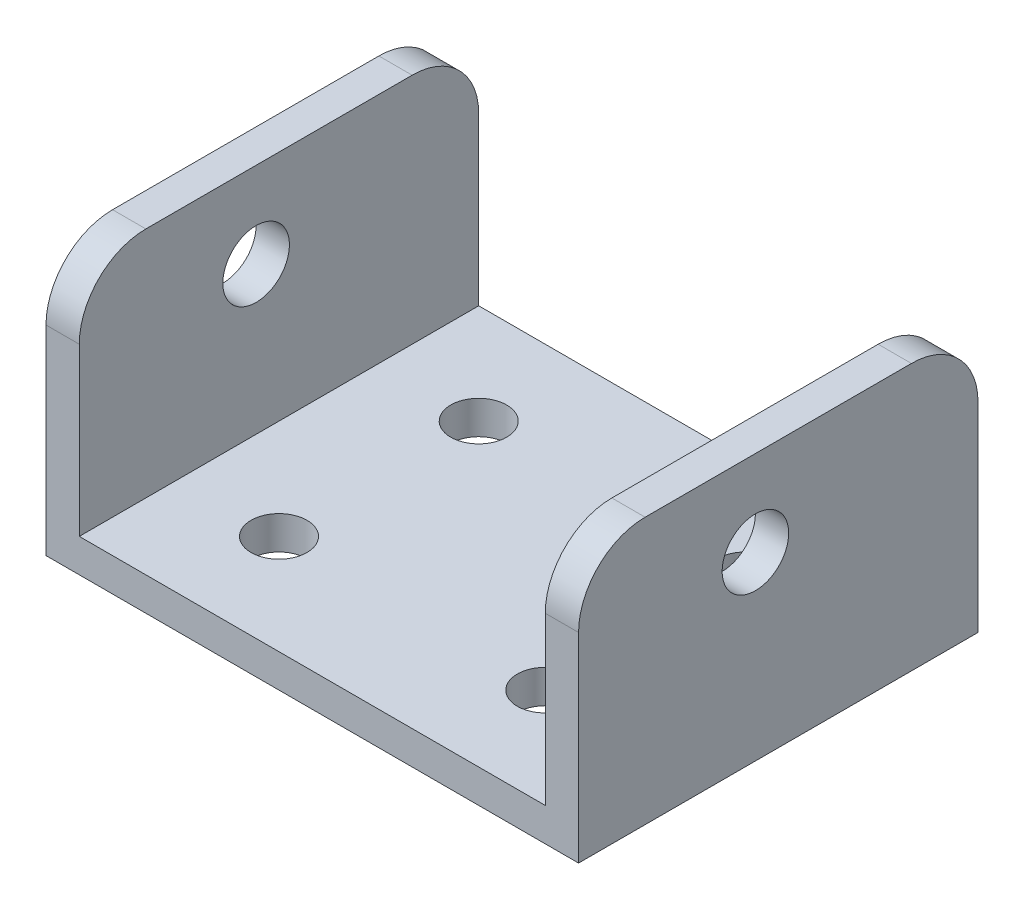
ISO-10303-21;
HEADER;
FILE_DESCRIPTION(('STEP AP214'),'2;1');
FILE_NAME('part.step','',(''),(''),'','','');
FILE_SCHEMA(('AUTOMOTIVE_DESIGN { 1 0 10303 214 1 1 1 1 }'));
ENDSEC;
DATA;
#1=APPLICATION_CONTEXT('core data for automotive mechanical design processes');
#2=APPLICATION_PROTOCOL_DEFINITION('international standard','automotive_design',2000,#1);
#3=PRODUCT_CONTEXT('',#1,'mechanical');
#4=PRODUCT('Part','Part','',(#3));
#5=PRODUCT_RELATED_PRODUCT_CATEGORY('part','',(#4));
#6=PRODUCT_DEFINITION_FORMATION('','',#4);
#7=PRODUCT_DEFINITION_CONTEXT('part definition',#1,'design');
#8=PRODUCT_DEFINITION('design','',#6,#7);
#9=PRODUCT_DEFINITION_SHAPE('','',#8);
#10=(LENGTH_UNIT() NAMED_UNIT(*) SI_UNIT(.MILLI.,.METRE.));
#11=(NAMED_UNIT(*) PLANE_ANGLE_UNIT() SI_UNIT($,.RADIAN.));
#12=(NAMED_UNIT(*) SI_UNIT($,.STERADIAN.) SOLID_ANGLE_UNIT());
#13=UNCERTAINTY_MEASURE_WITH_UNIT(LENGTH_MEASURE(1.E-05),#10,'distance_accuracy_value','');
#14=(GEOMETRIC_REPRESENTATION_CONTEXT(3) GLOBAL_UNCERTAINTY_ASSIGNED_CONTEXT((#13)) GLOBAL_UNIT_ASSIGNED_CONTEXT((#10,
#11,#12)) REPRESENTATION_CONTEXT('',''));
#15=CARTESIAN_POINT('',(0.,0.,0.));
#16=DIRECTION('',(0.,0.,1.));
#17=DIRECTION('',(1.,0.,0.));
#18=AXIS2_PLACEMENT_3D('',#15,#16,#17);
#19=CARTESIAN_POINT('',(-22.225,-9.525,38.1));
#20=DIRECTION('',(0.,-1.,0.));
#21=DIRECTION('',(0.,0.,-1.));
#22=AXIS2_PLACEMENT_3D('',#19,#20,#21);
#23=PLANE('',#22);
#24=CARTESIAN_POINT('',(-12.7,-9.525,28.575));
#25=DIRECTION('',(0.,1.,0.));
#26=DIRECTION('',(0.,0.,1.));
#27=AXIS2_PLACEMENT_3D('',#24,#25,#26);
#28=CIRCLE('',#27,2.667);
#29=CARTESIAN_POINT('',(-12.7,-9.525,31.242));
#30=VERTEX_POINT('',#29);
#31=EDGE_CURVE('E463',#30,#30,#28,.T.);
#32=ORIENTED_EDGE('',*,*,#31,.F.);
#33=EDGE_LOOP('',(#32));
#34=FACE_BOUND('',#33,.T.);
#35=CARTESIAN_POINT('',(12.7,-9.525,9.525));
#36=DIRECTION('',(0.,1.,0.));
#37=DIRECTION('',(0.,0.,1.));
#38=AXIS2_PLACEMENT_3D('',#35,#36,#37);
#39=CIRCLE('',#38,2.667);
#40=CARTESIAN_POINT('',(12.7,-9.525,12.192));
#41=VERTEX_POINT('',#40);
#42=EDGE_CURVE('E456',#41,#41,#39,.T.);
#43=ORIENTED_EDGE('',*,*,#42,.F.);
#44=EDGE_LOOP('',(#43));
#45=FACE_BOUND('',#44,.T.);
#46=CARTESIAN_POINT('',(-12.7,-9.525,9.525));
#47=DIRECTION('',(0.,1.,0.));
#48=DIRECTION('',(0.,0.,1.));
#49=AXIS2_PLACEMENT_3D('',#46,#47,#48);
#50=CIRCLE('',#49,2.667);
#51=CARTESIAN_POINT('',(-12.7,-9.525,12.192));
#52=VERTEX_POINT('',#51);
#53=EDGE_CURVE('E457',#52,#52,#50,.T.);
#54=ORIENTED_EDGE('',*,*,#53,.F.);
#55=EDGE_LOOP('',(#54));
#56=FACE_BOUND('',#55,.T.);
#57=CARTESIAN_POINT('',(12.7,-9.525,28.575));
#58=DIRECTION('',(0.,1.,0.));
#59=DIRECTION('',(0.,0.,1.));
#60=AXIS2_PLACEMENT_3D('',#57,#58,#59);
#61=CIRCLE('',#60,2.667);
#62=CARTESIAN_POINT('',(12.7,-9.525,31.242));
#63=VERTEX_POINT('',#62);
#64=EDGE_CURVE('E449',#63,#63,#61,.T.);
#65=ORIENTED_EDGE('',*,*,#64,.F.);
#66=EDGE_LOOP('',(#65));
#67=FACE_BOUND('',#66,.T.);
#68=DIRECTION('',(-1.,0.,0.));
#69=VECTOR('',#68,1.);
#70=CARTESIAN_POINT('',(-22.225,-9.525,0.));
#71=LINE('',#70,#69);
#72=CARTESIAN_POINT('',(22.225,-9.525,0.));
#73=VERTEX_POINT('',#72);
#74=CARTESIAN_POINT('',(-22.225,-9.525,0.));
#75=VERTEX_POINT('',#74);
#76=EDGE_CURVE('E145',#73,#75,#71,.T.);
#77=ORIENTED_EDGE('',*,*,#76,.T.);
#78=DIRECTION('',(0.,0.,-1.));
#79=VECTOR('',#78,1.);
#80=CARTESIAN_POINT('',(-22.225,-9.525,38.1));
#81=LINE('',#80,#79);
#82=CARTESIAN_POINT('',(-22.225,-9.525,38.1));
#83=VERTEX_POINT('',#82);
#84=EDGE_CURVE('E124',#83,#75,#81,.T.);
#85=ORIENTED_EDGE('',*,*,#84,.F.);
#86=DIRECTION('',(-1.,0.,0.));
#87=VECTOR('',#86,1.);
#88=CARTESIAN_POINT('',(-22.225,-9.525,38.1));
#89=LINE('',#88,#87);
#90=CARTESIAN_POINT('',(22.225,-9.525,38.1));
#91=VERTEX_POINT('',#90);
#92=EDGE_CURVE('E131',#91,#83,#89,.T.);
#93=ORIENTED_EDGE('',*,*,#92,.F.);
#94=DIRECTION('',(0.,0.,-1.));
#95=VECTOR('',#94,1.);
#96=CARTESIAN_POINT('',(22.225,-9.525,38.1));
#97=LINE('',#96,#95);
#98=EDGE_CURVE('E216',#91,#73,#97,.T.);
#99=ORIENTED_EDGE('',*,*,#98,.T.);
#100=EDGE_LOOP('',(#77,#85,#93,#99));
#101=FACE_BOUND('',#100,.T.);
#102=ADVANCED_FACE('F32',(#34,#45,#56,#67,#101),#23,.F.);
#103=CARTESIAN_POINT('',(-22.225,-9.525,38.1));
#104=DIRECTION('',(-1.,0.,0.));
#105=DIRECTION('',(0.,0.,1.));
#106=AXIS2_PLACEMENT_3D('',#103,#104,#105);
#107=PLANE('',#106);
#108=CARTESIAN_POINT('',(-22.225,4.54316792929754,21.2332082683315));
#109=DIRECTION('',(-1.,0.,0.));
#110=DIRECTION('',(0.,0.,1.));
#111=AXIS2_PLACEMENT_3D('',#108,#109,#110);
#112=CIRCLE('',#111,3.175);
#113=CARTESIAN_POINT('',(-22.225,4.54316792929754,24.4082082683315));
#114=VERTEX_POINT('',#113);
#115=EDGE_CURVE('E157',#114,#114,#112,.T.);
#116=ORIENTED_EDGE('',*,*,#115,.T.);
#117=EDGE_LOOP('',(#116));
#118=FACE_BOUND('',#117,.T.);
#119=DIRECTION('',(0.,1.,0.));
#120=VECTOR('',#119,1.);
#121=CARTESIAN_POINT('',(-22.225,-9.525,0.));
#122=LINE('',#121,#120);
#123=CARTESIAN_POINT('',(-22.225,6.35,0.));
#124=VERTEX_POINT('',#123);
#125=EDGE_CURVE('E201',#75,#124,#122,.T.);
#126=ORIENTED_EDGE('',*,*,#125,.T.);
#127=CARTESIAN_POINT('',(-22.225,6.35,6.35));
#128=DIRECTION('',(-1.,0.,0.));
#129=DIRECTION('',(0.,0.,1.));
#130=AXIS2_PLACEMENT_3D('',#127,#128,#129);
#131=CIRCLE('',#130,6.35);
#132=CARTESIAN_POINT('',(-22.225,12.7,6.35000000000002));
#133=VERTEX_POINT('',#132);
#134=EDGE_CURVE('E11',#124,#133,#131,.F.);
#135=ORIENTED_EDGE('',*,*,#134,.T.);
#136=DIRECTION('',(0.,0.,-1.));
#137=VECTOR('',#136,1.);
#138=CARTESIAN_POINT('',(-22.225,12.7,38.1));
#139=LINE('',#138,#137);
#140=CARTESIAN_POINT('',(-22.225,12.7,31.75));
#141=VERTEX_POINT('',#140);
#142=EDGE_CURVE('E147',#141,#133,#139,.T.);
#143=ORIENTED_EDGE('',*,*,#142,.F.);
#144=CARTESIAN_POINT('',(-22.225,6.35,31.75));
#145=DIRECTION('',(-1.,0.,0.));
#146=DIRECTION('',(0.,0.,1.));
#147=AXIS2_PLACEMENT_3D('',#144,#145,#146);
#148=CIRCLE('',#147,6.35);
#149=CARTESIAN_POINT('',(-22.225,6.35,38.1));
#150=VERTEX_POINT('',#149);
#151=EDGE_CURVE('E40',#141,#150,#148,.F.);
#152=ORIENTED_EDGE('',*,*,#151,.T.);
#153=DIRECTION('',(0.,1.,0.));
#154=VECTOR('',#153,1.);
#155=CARTESIAN_POINT('',(-22.225,-9.525,38.1));
#156=LINE('',#155,#154);
#157=EDGE_CURVE('E120',#83,#150,#156,.T.);
#158=ORIENTED_EDGE('',*,*,#157,.F.);
#159=ORIENTED_EDGE('',*,*,#84,.T.);
#160=EDGE_LOOP('',(#126,#135,#143,#152,#158,#159));
#161=FACE_BOUND('',#160,.T.);
#162=ADVANCED_FACE('F122',(#118,#161),#107,.F.);
#163=CARTESIAN_POINT('',(-25.4,12.7,38.1));
#164=DIRECTION('',(0.,-1.,0.));
#165=DIRECTION('',(0.,0.,-1.));
#166=AXIS2_PLACEMENT_3D('',#163,#164,#165);
#167=PLANE('',#166);
#168=ORIENTED_EDGE('',*,*,#142,.T.);
#169=DIRECTION('',(-1.,0.,0.));
#170=VECTOR('',#169,1.);
#171=CARTESIAN_POINT('',(-25.4,12.7,6.35));
#172=LINE('',#171,#170);
#173=CARTESIAN_POINT('',(-25.4,12.7,6.35000000000002));
#174=VERTEX_POINT('',#173);
#175=EDGE_CURVE('E179',#133,#174,#172,.T.);
#176=ORIENTED_EDGE('',*,*,#175,.T.);
#177=DIRECTION('',(0.,0.,-1.));
#178=VECTOR('',#177,1.);
#179=CARTESIAN_POINT('',(-25.4,12.7,38.1));
#180=LINE('',#179,#178);
#181=CARTESIAN_POINT('',(-25.4,12.7,31.75));
#182=VERTEX_POINT('',#181);
#183=EDGE_CURVE('E151',#182,#174,#180,.T.);
#184=ORIENTED_EDGE('',*,*,#183,.F.);
#185=DIRECTION('',(-1.,0.,0.));
#186=VECTOR('',#185,1.);
#187=CARTESIAN_POINT('',(-22.225,12.7,31.75));
#188=LINE('',#187,#186);
#189=EDGE_CURVE('E52',#182,#141,#188,.F.);
#190=ORIENTED_EDGE('',*,*,#189,.T.);
#191=EDGE_LOOP('',(#168,#176,#184,#190));
#192=FACE_BOUND('',#191,.T.);
#193=ADVANCED_FACE('F204',(#192),#167,.F.);
#194=CARTESIAN_POINT('',(-25.4,-12.7,38.1));
#195=DIRECTION('',(1.,0.,0.));
#196=DIRECTION('',(0.,0.,-1.));
#197=AXIS2_PLACEMENT_3D('',#194,#195,#196);
#198=PLANE('',#197);
#199=CARTESIAN_POINT('',(-25.4,4.54316792929754,21.2332082683315));
#200=DIRECTION('',(-1.,0.,0.));
#201=DIRECTION('',(0.,0.,1.));
#202=AXIS2_PLACEMENT_3D('',#199,#200,#201);
#203=CIRCLE('',#202,3.175);
#204=CARTESIAN_POINT('',(-25.4,4.54316792929754,24.4082082683315));
#205=VERTEX_POINT('',#204);
#206=EDGE_CURVE('E437',#205,#205,#203,.T.);
#207=ORIENTED_EDGE('',*,*,#206,.F.);
#208=EDGE_LOOP('',(#207));
#209=FACE_BOUND('',#208,.T.);
#210=ORIENTED_EDGE('',*,*,#183,.T.);
#211=CARTESIAN_POINT('',(-25.4,6.35,6.35));
#212=DIRECTION('',(1.,0.,0.));
#213=DIRECTION('',(0.,0.,-1.));
#214=AXIS2_PLACEMENT_3D('',#211,#212,#213);
#215=CIRCLE('',#214,6.35);
#216=CARTESIAN_POINT('',(-25.4,6.35,0.));
#217=VERTEX_POINT('',#216);
#218=EDGE_CURVE('E184',#174,#217,#215,.F.);
#219=ORIENTED_EDGE('',*,*,#218,.T.);
#220=DIRECTION('',(0.,-1.,0.));
#221=VECTOR('',#220,1.);
#222=CARTESIAN_POINT('',(-25.4,-12.7,0.));
#223=LINE('',#222,#221);
#224=CARTESIAN_POINT('',(-25.4,-12.7,0.));
#225=VERTEX_POINT('',#224);
#226=EDGE_CURVE('E190',#217,#225,#223,.T.);
#227=ORIENTED_EDGE('',*,*,#226,.T.);
#228=DIRECTION('',(0.,0.,-1.));
#229=VECTOR('',#228,1.);
#230=CARTESIAN_POINT('',(-25.4,-12.7,38.1));
#231=LINE('',#230,#229);
#232=CARTESIAN_POINT('',(-25.4,-12.7,38.1));
#233=VERTEX_POINT('',#232);
#234=EDGE_CURVE('E207',#233,#225,#231,.T.);
#235=ORIENTED_EDGE('',*,*,#234,.F.);
#236=DIRECTION('',(0.,-1.,0.));
#237=VECTOR('',#236,1.);
#238=CARTESIAN_POINT('',(-25.4,-12.7,38.1));
#239=LINE('',#238,#237);
#240=CARTESIAN_POINT('',(-25.4,6.35,38.1));
#241=VERTEX_POINT('',#240);
#242=EDGE_CURVE('E130',#241,#233,#239,.T.);
#243=ORIENTED_EDGE('',*,*,#242,.F.);
#244=CARTESIAN_POINT('',(-25.4,6.35,31.75));
#245=DIRECTION('',(1.,0.,0.));
#246=DIRECTION('',(0.,0.,-1.));
#247=AXIS2_PLACEMENT_3D('',#244,#245,#246);
#248=CIRCLE('',#247,6.35);
#249=EDGE_CURVE('E182',#241,#182,#248,.F.);
#250=ORIENTED_EDGE('',*,*,#249,.T.);
#251=EDGE_LOOP('',(#210,#219,#227,#235,#243,#250));
#252=FACE_BOUND('',#251,.T.);
#253=ADVANCED_FACE('F188',(#209,#252),#198,.F.);
#254=CARTESIAN_POINT('',(-25.4,-12.7,38.1));
#255=DIRECTION('',(0.,1.,0.));
#256=DIRECTION('',(0.,0.,1.));
#257=AXIS2_PLACEMENT_3D('',#254,#255,#256);
#258=PLANE('',#257);
#259=CARTESIAN_POINT('',(-12.7,-12.7,28.575));
#260=DIRECTION('',(0.,1.,0.));
#261=DIRECTION('',(0.,0.,1.));
#262=AXIS2_PLACEMENT_3D('',#259,#260,#261);
#263=CIRCLE('',#262,2.667);
#264=CARTESIAN_POINT('',(-12.7,-12.7,31.242));
#265=VERTEX_POINT('',#264);
#266=EDGE_CURVE('E452',#265,#265,#263,.F.);
#267=ORIENTED_EDGE('',*,*,#266,.F.);
#268=EDGE_LOOP('',(#267));
#269=FACE_BOUND('',#268,.T.);
#270=CARTESIAN_POINT('',(12.7,-12.7,9.525));
#271=DIRECTION('',(0.,1.,0.));
#272=DIRECTION('',(0.,0.,1.));
#273=AXIS2_PLACEMENT_3D('',#270,#271,#272);
#274=CIRCLE('',#273,2.667);
#275=CARTESIAN_POINT('',(12.7,-12.7,12.192));
#276=VERTEX_POINT('',#275);
#277=EDGE_CURVE('E460',#276,#276,#274,.F.);
#278=ORIENTED_EDGE('',*,*,#277,.F.);
#279=EDGE_LOOP('',(#278));
#280=FACE_BOUND('',#279,.T.);
#281=CARTESIAN_POINT('',(-12.7,-12.7,9.525));
#282=DIRECTION('',(0.,1.,0.));
#283=DIRECTION('',(0.,0.,1.));
#284=AXIS2_PLACEMENT_3D('',#281,#282,#283);
#285=CIRCLE('',#284,2.667);
#286=CARTESIAN_POINT('',(-12.7,-12.7,12.192));
#287=VERTEX_POINT('',#286);
#288=EDGE_CURVE('E453',#287,#287,#285,.F.);
#289=ORIENTED_EDGE('',*,*,#288,.F.);
#290=EDGE_LOOP('',(#289));
#291=FACE_BOUND('',#290,.T.);
#292=CARTESIAN_POINT('',(12.7,-12.7,28.575));
#293=DIRECTION('',(0.,1.,0.));
#294=DIRECTION('',(0.,0.,1.));
#295=AXIS2_PLACEMENT_3D('',#292,#293,#294);
#296=CIRCLE('',#295,2.667);
#297=CARTESIAN_POINT('',(12.7,-12.7,31.242));
#298=VERTEX_POINT('',#297);
#299=EDGE_CURVE('E440',#298,#298,#296,.F.);
#300=ORIENTED_EDGE('',*,*,#299,.F.);
#301=EDGE_LOOP('',(#300));
#302=FACE_BOUND('',#301,.T.);
#303=DIRECTION('',(1.,0.,0.));
#304=VECTOR('',#303,1.);
#305=CARTESIAN_POINT('',(-25.4,-12.7,0.));
#306=LINE('',#305,#304);
#307=CARTESIAN_POINT('',(25.4,-12.7,0.));
#308=VERTEX_POINT('',#307);
#309=EDGE_CURVE('E200',#225,#308,#306,.T.);
#310=ORIENTED_EDGE('',*,*,#309,.T.);
#311=DIRECTION('',(0.,0.,-1.));
#312=VECTOR('',#311,1.);
#313=CARTESIAN_POINT('',(25.4,-12.7,38.1));
#314=LINE('',#313,#312);
#315=CARTESIAN_POINT('',(25.4,-12.7,38.1));
#316=VERTEX_POINT('',#315);
#317=EDGE_CURVE('E231',#316,#308,#314,.T.);
#318=ORIENTED_EDGE('',*,*,#317,.F.);
#319=DIRECTION('',(1.,0.,0.));
#320=VECTOR('',#319,1.);
#321=CARTESIAN_POINT('',(-25.4,-12.7,38.1));
#322=LINE('',#321,#320);
#323=EDGE_CURVE('E209',#233,#316,#322,.T.);
#324=ORIENTED_EDGE('',*,*,#323,.F.);
#325=ORIENTED_EDGE('',*,*,#234,.T.);
#326=EDGE_LOOP('',(#310,#318,#324,#325));
#327=FACE_BOUND('',#326,.T.);
#328=ADVANCED_FACE('F235',(#269,#280,#291,#302,#327),#258,.F.);
#329=CARTESIAN_POINT('',(25.4,-12.7,38.1));
#330=DIRECTION('',(-1.,0.,0.));
#331=DIRECTION('',(0.,0.,1.));
#332=AXIS2_PLACEMENT_3D('',#329,#330,#331);
#333=PLANE('',#332);
#334=CARTESIAN_POINT('',(25.4,4.54316792929754,21.2332082683315));
#335=DIRECTION('',(-1.,0.,0.));
#336=DIRECTION('',(0.,0.,1.));
#337=AXIS2_PLACEMENT_3D('',#334,#335,#336);
#338=CIRCLE('',#337,3.175);
#339=CARTESIAN_POINT('',(25.4,4.54316792929754,24.4082082683315));
#340=VERTEX_POINT('',#339);
#341=EDGE_CURVE('E158',#340,#340,#338,.T.);
#342=ORIENTED_EDGE('',*,*,#341,.T.);
#343=EDGE_LOOP('',(#342));
#344=FACE_BOUND('',#343,.T.);
#345=DIRECTION('',(0.,0.,-1.));
#346=VECTOR('',#345,1.);
#347=CARTESIAN_POINT('',(25.4,12.7,38.1));
#348=LINE('',#347,#346);
#349=CARTESIAN_POINT('',(25.4,12.7,31.75));
#350=VERTEX_POINT('',#349);
#351=CARTESIAN_POINT('',(25.4,12.7,6.35000000000002));
#352=VERTEX_POINT('',#351);
#353=EDGE_CURVE('E228',#350,#352,#348,.T.);
#354=ORIENTED_EDGE('',*,*,#353,.F.);
#355=CARTESIAN_POINT('',(25.4,6.35,31.75));
#356=DIRECTION('',(-1.,0.,0.));
#357=DIRECTION('',(0.,0.,1.));
#358=AXIS2_PLACEMENT_3D('',#355,#356,#357);
#359=CIRCLE('',#358,6.35);
#360=CARTESIAN_POINT('',(25.4,6.35,38.1));
#361=VERTEX_POINT('',#360);
#362=EDGE_CURVE('E172',#350,#361,#359,.F.);
#363=ORIENTED_EDGE('',*,*,#362,.T.);
#364=DIRECTION('',(0.,1.,0.));
#365=VECTOR('',#364,1.);
#366=CARTESIAN_POINT('',(25.4,-12.7,38.1));
#367=LINE('',#366,#365);
#368=EDGE_CURVE('E211',#316,#361,#367,.T.);
#369=ORIENTED_EDGE('',*,*,#368,.F.);
#370=ORIENTED_EDGE('',*,*,#317,.T.);
#371=DIRECTION('',(0.,1.,0.));
#372=VECTOR('',#371,1.);
#373=CARTESIAN_POINT('',(25.4,-12.7,0.));
#374=LINE('',#373,#372);
#375=CARTESIAN_POINT('',(25.4,6.35,0.));
#376=VERTEX_POINT('',#375);
#377=EDGE_CURVE('E220',#308,#376,#374,.T.);
#378=ORIENTED_EDGE('',*,*,#377,.T.);
#379=CARTESIAN_POINT('',(25.4,6.35,6.35));
#380=DIRECTION('',(-1.,0.,0.));
#381=DIRECTION('',(0.,0.,1.));
#382=AXIS2_PLACEMENT_3D('',#379,#380,#381);
#383=CIRCLE('',#382,6.35);
#384=EDGE_CURVE('E170',#376,#352,#383,.F.);
#385=ORIENTED_EDGE('',*,*,#384,.T.);
#386=EDGE_LOOP('',(#354,#363,#369,#370,#378,#385));
#387=FACE_BOUND('',#386,.T.);
#388=ADVANCED_FACE('F255',(#344,#387),#333,.F.);
#389=CARTESIAN_POINT('',(25.4,12.7,38.1));
#390=DIRECTION('',(0.,-1.,0.));
#391=DIRECTION('',(0.,0.,-1.));
#392=AXIS2_PLACEMENT_3D('',#389,#390,#391);
#393=PLANE('',#392);
#394=DIRECTION('',(0.,0.,-1.));
#395=VECTOR('',#394,1.);
#396=CARTESIAN_POINT('',(22.225,12.7,38.1));
#397=LINE('',#396,#395);
#398=CARTESIAN_POINT('',(22.225,12.7,31.75));
#399=VERTEX_POINT('',#398);
#400=CARTESIAN_POINT('',(22.225,12.7,6.35000000000002));
#401=VERTEX_POINT('',#400);
#402=EDGE_CURVE('E225',#399,#401,#397,.T.);
#403=ORIENTED_EDGE('',*,*,#402,.F.);
#404=DIRECTION('',(-1.,0.,0.));
#405=VECTOR('',#404,1.);
#406=CARTESIAN_POINT('',(25.4,12.7,31.75));
#407=LINE('',#406,#405);
#408=EDGE_CURVE('E168',#399,#350,#407,.F.);
#409=ORIENTED_EDGE('',*,*,#408,.T.);
#410=ORIENTED_EDGE('',*,*,#353,.T.);
#411=DIRECTION('',(-1.,0.,0.));
#412=VECTOR('',#411,1.);
#413=CARTESIAN_POINT('',(25.4,12.7,6.35));
#414=LINE('',#413,#412);
#415=EDGE_CURVE('E165',#352,#401,#414,.T.);
#416=ORIENTED_EDGE('',*,*,#415,.T.);
#417=EDGE_LOOP('',(#403,#409,#410,#416));
#418=FACE_BOUND('',#417,.T.);
#419=ADVANCED_FACE('F248',(#418),#393,.F.);
#420=CARTESIAN_POINT('',(22.225,-9.525,38.1));
#421=DIRECTION('',(1.,0.,0.));
#422=DIRECTION('',(0.,0.,-1.));
#423=AXIS2_PLACEMENT_3D('',#420,#421,#422);
#424=PLANE('',#423);
#425=CARTESIAN_POINT('',(22.225,4.54316792929754,21.2332082683315));
#426=DIRECTION('',(1.,0.,0.));
#427=DIRECTION('',(0.,0.,-1.));
#428=AXIS2_PLACEMENT_3D('',#425,#426,#427);
#429=CIRCLE('',#428,3.175);
#430=CARTESIAN_POINT('',(22.225,4.54316792929754,18.0582082683315));
#431=VERTEX_POINT('',#430);
#432=EDGE_CURVE('E155',#431,#431,#429,.T.);
#433=ORIENTED_EDGE('',*,*,#432,.T.);
#434=EDGE_LOOP('',(#433));
#435=FACE_BOUND('',#434,.T.);
#436=DIRECTION('',(0.,-1.,0.));
#437=VECTOR('',#436,1.);
#438=CARTESIAN_POINT('',(22.225,-9.525,38.1));
#439=LINE('',#438,#437);
#440=CARTESIAN_POINT('',(22.225,6.35,38.1));
#441=VERTEX_POINT('',#440);
#442=EDGE_CURVE('E138',#441,#91,#439,.T.);
#443=ORIENTED_EDGE('',*,*,#442,.F.);
#444=CARTESIAN_POINT('',(22.225,6.35,31.75));
#445=DIRECTION('',(1.,0.,0.));
#446=DIRECTION('',(0.,0.,-1.));
#447=AXIS2_PLACEMENT_3D('',#444,#445,#446);
#448=CIRCLE('',#447,6.35);
#449=EDGE_CURVE('E163',#441,#399,#448,.F.);
#450=ORIENTED_EDGE('',*,*,#449,.T.);
#451=ORIENTED_EDGE('',*,*,#402,.T.);
#452=CARTESIAN_POINT('',(22.225,6.35,6.35));
#453=DIRECTION('',(1.,0.,0.));
#454=DIRECTION('',(0.,0.,-1.));
#455=AXIS2_PLACEMENT_3D('',#452,#453,#454);
#456=CIRCLE('',#455,6.35);
#457=CARTESIAN_POINT('',(22.225,6.35,0.));
#458=VERTEX_POINT('',#457);
#459=EDGE_CURVE('E161',#401,#458,#456,.F.);
#460=ORIENTED_EDGE('',*,*,#459,.T.);
#461=DIRECTION('',(0.,-1.,0.));
#462=VECTOR('',#461,1.);
#463=CARTESIAN_POINT('',(22.225,-9.525,0.));
#464=LINE('',#463,#462);
#465=EDGE_CURVE('E142',#458,#73,#464,.T.);
#466=ORIENTED_EDGE('',*,*,#465,.T.);
#467=ORIENTED_EDGE('',*,*,#98,.F.);
#468=EDGE_LOOP('',(#443,#450,#451,#460,#466,#467));
#469=FACE_BOUND('',#468,.T.);
#470=ADVANCED_FACE('F246',(#435,#469),#424,.F.);
#471=CARTESIAN_POINT('',(0.,0.,38.1));
#472=DIRECTION('',(0.,0.,1.));
#473=DIRECTION('',(1.,0.,0.));
#474=AXIS2_PLACEMENT_3D('',#471,#472,#473);
#475=PLANE('',#474);
#476=ORIENTED_EDGE('',*,*,#368,.T.);
#477=DIRECTION('',(-1.,0.,0.));
#478=VECTOR('',#477,1.);
#479=CARTESIAN_POINT('',(22.225,6.35,38.1));
#480=LINE('',#479,#478);
#481=EDGE_CURVE('E149',#361,#441,#480,.T.);
#482=ORIENTED_EDGE('',*,*,#481,.T.);
#483=ORIENTED_EDGE('',*,*,#442,.T.);
#484=ORIENTED_EDGE('',*,*,#92,.T.);
#485=ORIENTED_EDGE('',*,*,#157,.T.);
#486=DIRECTION('',(-1.,0.,0.));
#487=VECTOR('',#486,1.);
#488=CARTESIAN_POINT('',(-25.4,6.35,38.1));
#489=LINE('',#488,#487);
#490=EDGE_CURVE('E146',#150,#241,#489,.T.);
#491=ORIENTED_EDGE('',*,*,#490,.T.);
#492=ORIENTED_EDGE('',*,*,#242,.T.);
#493=ORIENTED_EDGE('',*,*,#323,.T.);
#494=EDGE_LOOP('',(#476,#482,#483,#484,#485,#491,#492,#493));
#495=FACE_BOUND('',#494,.T.);
#496=ADVANCED_FACE('F135',(#495),#475,.T.);
#497=CARTESIAN_POINT('',(0.,0.,0.));
#498=DIRECTION('',(0.,0.,1.));
#499=DIRECTION('',(1.,0.,0.));
#500=AXIS2_PLACEMENT_3D('',#497,#498,#499);
#501=PLANE('',#500);
#502=ORIENTED_EDGE('',*,*,#465,.F.);
#503=DIRECTION('',(-1.,0.,0.));
#504=VECTOR('',#503,1.);
#505=CARTESIAN_POINT('',(0.,6.35,0.));
#506=LINE('',#505,#504);
#507=EDGE_CURVE('E176',#458,#376,#506,.F.);
#508=ORIENTED_EDGE('',*,*,#507,.T.);
#509=ORIENTED_EDGE('',*,*,#377,.F.);
#510=ORIENTED_EDGE('',*,*,#309,.F.);
#511=ORIENTED_EDGE('',*,*,#226,.F.);
#512=DIRECTION('',(-1.,0.,0.));
#513=VECTOR('',#512,1.);
#514=CARTESIAN_POINT('',(0.,6.35,0.));
#515=LINE('',#514,#513);
#516=EDGE_CURVE('E174',#217,#124,#515,.F.);
#517=ORIENTED_EDGE('',*,*,#516,.T.);
#518=ORIENTED_EDGE('',*,*,#125,.F.);
#519=ORIENTED_EDGE('',*,*,#76,.F.);
#520=EDGE_LOOP('',(#502,#508,#509,#510,#511,#517,#518,#519));
#521=FACE_BOUND('',#520,.T.);
#522=ADVANCED_FACE('F198',(#521),#501,.F.);
#523=CARTESIAN_POINT('',(25.4,4.54316792929754,21.2332082683315));
#524=DIRECTION('',(-1.,0.,0.));
#525=DIRECTION('',(0.,0.,1.));
#526=AXIS2_PLACEMENT_3D('',#523,#524,#525);
#527=CYLINDRICAL_SURFACE('',#526,3.175);
#528=ORIENTED_EDGE('',*,*,#341,.F.);
#529=EDGE_LOOP('',(#528));
#530=FACE_BOUND('',#529,.T.);
#531=ORIENTED_EDGE('',*,*,#432,.F.);
#532=EDGE_LOOP('',(#531));
#533=FACE_BOUND('',#532,.T.);
#534=ADVANCED_FACE('F316',(#530,#533),#527,.F.);
#535=ORIENTED_EDGE('',*,*,#206,.T.);
#536=EDGE_LOOP('',(#535));
#537=FACE_BOUND('',#536,.T.);
#538=ORIENTED_EDGE('',*,*,#115,.F.);
#539=EDGE_LOOP('',(#538));
#540=FACE_BOUND('',#539,.T.);
#541=ADVANCED_FACE('F406',(#537,#540),#527,.F.);
#542=CARTESIAN_POINT('',(12.7,-12.701,28.575));
#543=DIRECTION('',(0.,1.,0.));
#544=DIRECTION('',(0.,0.,1.));
#545=AXIS2_PLACEMENT_3D('',#542,#543,#544);
#546=CYLINDRICAL_SURFACE('',#545,2.667);
#547=ORIENTED_EDGE('',*,*,#64,.T.);
#548=EDGE_LOOP('',(#547));
#549=FACE_BOUND('',#548,.T.);
#550=ORIENTED_EDGE('',*,*,#299,.T.);
#551=EDGE_LOOP('',(#550));
#552=FACE_BOUND('',#551,.T.);
#553=ADVANCED_FACE('F396',(#549,#552),#546,.F.);
#554=CARTESIAN_POINT('',(-12.7,-12.701,9.525));
#555=DIRECTION('',(0.,1.,0.));
#556=DIRECTION('',(0.,0.,1.));
#557=AXIS2_PLACEMENT_3D('',#554,#555,#556);
#558=CYLINDRICAL_SURFACE('',#557,2.667);
#559=ORIENTED_EDGE('',*,*,#53,.T.);
#560=EDGE_LOOP('',(#559));
#561=FACE_BOUND('',#560,.T.);
#562=ORIENTED_EDGE('',*,*,#288,.T.);
#563=EDGE_LOOP('',(#562));
#564=FACE_BOUND('',#563,.T.);
#565=ADVANCED_FACE('F386',(#561,#564),#558,.F.);
#566=CARTESIAN_POINT('',(12.7,-12.701,9.525));
#567=DIRECTION('',(0.,1.,0.));
#568=DIRECTION('',(0.,0.,1.));
#569=AXIS2_PLACEMENT_3D('',#566,#567,#568);
#570=CYLINDRICAL_SURFACE('',#569,2.667);
#571=ORIENTED_EDGE('',*,*,#42,.T.);
#572=EDGE_LOOP('',(#571));
#573=FACE_BOUND('',#572,.T.);
#574=ORIENTED_EDGE('',*,*,#277,.T.);
#575=EDGE_LOOP('',(#574));
#576=FACE_BOUND('',#575,.T.);
#577=ADVANCED_FACE('F376',(#573,#576),#570,.F.);
#578=CARTESIAN_POINT('',(-12.7,-12.701,28.575));
#579=DIRECTION('',(0.,1.,0.));
#580=DIRECTION('',(0.,0.,1.));
#581=AXIS2_PLACEMENT_3D('',#578,#579,#580);
#582=CYLINDRICAL_SURFACE('',#581,2.667);
#583=ORIENTED_EDGE('',*,*,#31,.T.);
#584=EDGE_LOOP('',(#583));
#585=FACE_BOUND('',#584,.T.);
#586=ORIENTED_EDGE('',*,*,#266,.T.);
#587=EDGE_LOOP('',(#586));
#588=FACE_BOUND('',#587,.T.);
#589=ADVANCED_FACE('F281',(#585,#588),#582,.F.);
#590=CARTESIAN_POINT('',(0.,6.35,31.75));
#591=DIRECTION('',(1.,0.,0.));
#592=DIRECTION('',(0.,0.,-1.));
#593=AXIS2_PLACEMENT_3D('',#590,#591,#592);
#594=CYLINDRICAL_SURFACE('',#593,6.35);
#595=ORIENTED_EDGE('',*,*,#362,.F.);
#596=ORIENTED_EDGE('',*,*,#408,.F.);
#597=ORIENTED_EDGE('',*,*,#449,.F.);
#598=ORIENTED_EDGE('',*,*,#481,.F.);
#599=EDGE_LOOP('',(#595,#596,#597,#598));
#600=FACE_BOUND('',#599,.T.);
#601=ADVANCED_FACE('F242',(#600),#594,.T.);
#602=CARTESIAN_POINT('',(25.4,6.35,6.35));
#603=DIRECTION('',(-1.,0.,0.));
#604=DIRECTION('',(0.,0.,1.));
#605=AXIS2_PLACEMENT_3D('',#602,#603,#604);
#606=CYLINDRICAL_SURFACE('',#605,6.35);
#607=ORIENTED_EDGE('',*,*,#384,.F.);
#608=ORIENTED_EDGE('',*,*,#507,.F.);
#609=ORIENTED_EDGE('',*,*,#459,.F.);
#610=ORIENTED_EDGE('',*,*,#415,.F.);
#611=EDGE_LOOP('',(#607,#608,#609,#610));
#612=FACE_BOUND('',#611,.T.);
#613=ADVANCED_FACE('F253',(#612),#606,.T.);
#614=CARTESIAN_POINT('',(-25.4,6.35,6.35));
#615=DIRECTION('',(-1.,0.,0.));
#616=DIRECTION('',(0.,0.,1.));
#617=AXIS2_PLACEMENT_3D('',#614,#615,#616);
#618=CYLINDRICAL_SURFACE('',#617,6.35);
#619=ORIENTED_EDGE('',*,*,#134,.F.);
#620=ORIENTED_EDGE('',*,*,#516,.F.);
#621=ORIENTED_EDGE('',*,*,#218,.F.);
#622=ORIENTED_EDGE('',*,*,#175,.F.);
#623=EDGE_LOOP('',(#619,#620,#621,#622));
#624=FACE_BOUND('',#623,.T.);
#625=ADVANCED_FACE('F203',(#624),#618,.T.);
#626=CARTESIAN_POINT('',(0.,6.35,31.75));
#627=DIRECTION('',(1.,0.,0.));
#628=DIRECTION('',(0.,0.,-1.));
#629=AXIS2_PLACEMENT_3D('',#626,#627,#628);
#630=CYLINDRICAL_SURFACE('',#629,6.35);
#631=ORIENTED_EDGE('',*,*,#151,.F.);
#632=ORIENTED_EDGE('',*,*,#189,.F.);
#633=ORIENTED_EDGE('',*,*,#249,.F.);
#634=ORIENTED_EDGE('',*,*,#490,.F.);
#635=EDGE_LOOP('',(#631,#632,#633,#634));
#636=FACE_BOUND('',#635,.T.);
#637=ADVANCED_FACE('F34',(#636),#630,.T.);
#638=CLOSED_SHELL('',(#102,#162,#193,#253,#328,#388,#419,#470,#496,#522,#534,#541,#553,#565,
#577,#589,#601,#613,#625,#637));
#639=MANIFOLD_SOLID_BREP('B2',#638);
#640=ADVANCED_BREP_SHAPE_REPRESENTATION('',(#18,#639),#14);
#641=SHAPE_DEFINITION_REPRESENTATION(#9,#640);
ENDSEC;
END-ISO-10303-21;
